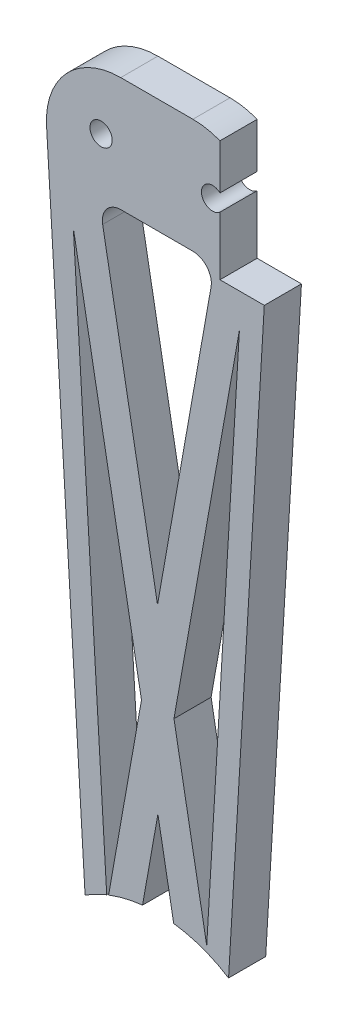
ISO-10303-21;
HEADER;
FILE_DESCRIPTION(('STEP AP214'),'2;1');
FILE_NAME('part.step','',(''),(''),'','','');
FILE_SCHEMA(('AUTOMOTIVE_DESIGN { 1 0 10303 214 1 1 1 1 }'));
ENDSEC;
DATA;
#1=APPLICATION_CONTEXT('core data for automotive mechanical design processes');
#2=APPLICATION_PROTOCOL_DEFINITION('international standard','automotive_design',2000,#1);
#3=PRODUCT_CONTEXT('',#1,'mechanical');
#4=PRODUCT('Part','Part','',(#3));
#5=PRODUCT_RELATED_PRODUCT_CATEGORY('part','',(#4));
#6=PRODUCT_DEFINITION_FORMATION('','',#4);
#7=PRODUCT_DEFINITION_CONTEXT('part definition',#1,'design');
#8=PRODUCT_DEFINITION('design','',#6,#7);
#9=PRODUCT_DEFINITION_SHAPE('','',#8);
#10=(LENGTH_UNIT() NAMED_UNIT(*) SI_UNIT(.MILLI.,.METRE.));
#11=(NAMED_UNIT(*) PLANE_ANGLE_UNIT() SI_UNIT($,.RADIAN.));
#12=(NAMED_UNIT(*) SI_UNIT($,.STERADIAN.) SOLID_ANGLE_UNIT());
#13=UNCERTAINTY_MEASURE_WITH_UNIT(LENGTH_MEASURE(1.E-05),#10,'distance_accuracy_value','');
#14=(GEOMETRIC_REPRESENTATION_CONTEXT(3) GLOBAL_UNCERTAINTY_ASSIGNED_CONTEXT((#13)) GLOBAL_UNIT_ASSIGNED_CONTEXT((#10,
#11,#12)) REPRESENTATION_CONTEXT('',''));
#15=CARTESIAN_POINT('',(0.,0.,0.));
#16=DIRECTION('',(0.,0.,1.));
#17=DIRECTION('',(1.,0.,0.));
#18=AXIS2_PLACEMENT_3D('',#15,#16,#17);
#19=CARTESIAN_POINT('',(0.,0.,10.));
#20=DIRECTION('',(0.,0.,1.));
#21=DIRECTION('',(1.,0.,0.));
#22=AXIS2_PLACEMENT_3D('',#19,#20,#21);
#23=PLANE('',#22);
#24=CARTESIAN_POINT('',(0.,-210.,10.));
#25=DIRECTION('',(0.,0.,1.));
#26=DIRECTION('',(1.,0.,0.));
#27=AXIS2_PLACEMENT_3D('',#24,#25,#26);
#28=CIRCLE('',#27,36.);
#29=CARTESIAN_POINT('',(-3.84009202515425,-174.205395752455,10.));
#30=VERTEX_POINT('',#29);
#31=CARTESIAN_POINT('',(-12.9756578020108,-176.419763184201,10.));
#32=VERTEX_POINT('',#31);
#33=EDGE_CURVE('E295',#30,#32,#28,.T.);
#34=ORIENTED_EDGE('',*,*,#33,.F.);
#35=DIRECTION('',(0.174574666070561,0.984643938673444,0.));
#36=VECTOR('',#35,1.);
#37=CARTESIAN_POINT('',(26.2217824014059,-4.64905000346376,10.));
#38=LINE('',#37,#36);
#39=CARTESIAN_POINT('',(0.29160959832128,-150.901585116392,10.));
#40=VERTEX_POINT('',#39);
#41=EDGE_CURVE('E501',#30,#40,#38,.T.);
#42=ORIENTED_EDGE('',*,*,#41,.T.);
#43=DIRECTION('',(-0.178826073356073,0.983880701857724,0.));
#44=VECTOR('',#43,1.);
#45=CARTESIAN_POINT('',(-26.2678721622271,-4.77433943497515,10.));
#46=LINE('',#45,#44);
#47=CARTESIAN_POINT('',(4.54217202074157,-174.287695771149,10.));
#48=VERTEX_POINT('',#47);
#49=EDGE_CURVE('E504',#48,#40,#46,.T.);
#50=ORIENTED_EDGE('',*,*,#49,.F.);
#51=CARTESIAN_POINT('',(0.,-210.,10.));
#52=DIRECTION('',(0.,0.,1.));
#53=DIRECTION('',(1.,0.,0.));
#54=AXIS2_PLACEMENT_3D('',#51,#52,#53);
#55=CIRCLE('',#54,36.);
#56=CARTESIAN_POINT('',(19.3085635130686,-179.616132980448,10.));
#57=VERTEX_POINT('',#56);
#58=EDGE_CURVE('E546',#57,#48,#55,.T.);
#59=ORIENTED_EDGE('',*,*,#58,.F.);
#60=DIRECTION('',(-0.0594186399842153,-0.998233151734817,0.));
#61=VECTOR('',#60,1.);
#62=CARTESIAN_POINT('',(29.8940827566728,-1.77940968789719,10.));
#63=LINE('',#62,#61);
#64=CARTESIAN_POINT('',(28.9285714285714,-18.,10.));
#65=VERTEX_POINT('',#64);
#66=EDGE_CURVE('E389',#65,#57,#63,.T.);
#67=ORIENTED_EDGE('',*,*,#66,.F.);
#68=DIRECTION('',(1.,0.,0.));
#69=VECTOR('',#68,1.);
#70=CARTESIAN_POINT('',(0.,-18.,10.));
#71=LINE('',#70,#69);
#72=CARTESIAN_POINT('',(17.,-18.,10.));
#73=VERTEX_POINT('',#72);
#74=EDGE_CURVE('E523',#73,#65,#71,.T.);
#75=ORIENTED_EDGE('',*,*,#74,.F.);
#76=DIRECTION('',(0.,1.,0.));
#77=VECTOR('',#76,1.);
#78=CARTESIAN_POINT('',(17.,0.,10.));
#79=LINE('',#78,#77);
#80=CARTESIAN_POINT('',(17.,-2.23606797749979,10.));
#81=VERTEX_POINT('',#80);
#82=EDGE_CURVE('E525',#73,#81,#79,.T.);
#83=ORIENTED_EDGE('',*,*,#82,.T.);
#84=CARTESIAN_POINT('',(15.,0.,10.));
#85=DIRECTION('',(0.,0.,1.));
#86=DIRECTION('',(1.,0.,0.));
#87=AXIS2_PLACEMENT_3D('',#84,#85,#86);
#88=CIRCLE('',#87,3.);
#89=CARTESIAN_POINT('',(17.,2.23606797749979,10.));
#90=VERTEX_POINT('',#89);
#91=EDGE_CURVE('E394',#90,#81,#88,.T.);
#92=ORIENTED_EDGE('',*,*,#91,.F.);
#93=DIRECTION('',(0.,1.,0.));
#94=VECTOR('',#93,1.);
#95=CARTESIAN_POINT('',(17.,0.,10.));
#96=LINE('',#95,#94);
#97=CARTESIAN_POINT('',(17.,14.395591770238,10.));
#98=VERTEX_POINT('',#97);
#99=EDGE_CURVE('E528',#90,#98,#96,.T.);
#100=ORIENTED_EDGE('',*,*,#99,.T.);
#101=CARTESIAN_POINT('',(9.71283934950197,-4.22958714578407,10.));
#102=DIRECTION('',(0.,0.,1.));
#103=DIRECTION('',(1.,0.,0.));
#104=AXIS2_PLACEMENT_3D('',#101,#102,#103);
#105=CIRCLE('',#104,20.);
#106=CARTESIAN_POINT('',(9.71283934950197,15.7704128542159,10.));
#107=VERTEX_POINT('',#106);
#108=EDGE_CURVE('E336',#98,#107,#105,.T.);
#109=ORIENTED_EDGE('',*,*,#108,.T.);
#110=DIRECTION('',(1.,0.,0.));
#111=VECTOR('',#110,1.);
#112=CARTESIAN_POINT('',(0.,15.7704128542159,10.));
#113=LINE('',#112,#111);
#114=CARTESIAN_POINT('',(-9.71283934950197,15.7704128542159,10.));
#115=VERTEX_POINT('',#114);
#116=EDGE_CURVE('E392',#115,#107,#113,.T.);
#117=ORIENTED_EDGE('',*,*,#116,.F.);
#118=CARTESIAN_POINT('',(-9.71283934950197,-4.22958714578407,10.));
#119=DIRECTION('',(0.,0.,1.));
#120=DIRECTION('',(1.,0.,0.));
#121=AXIS2_PLACEMENT_3D('',#118,#119,#120);
#122=CIRCLE('',#121,20.);
#123=CARTESIAN_POINT('',(-29.6775023841983,-5.41795994546837,10.));
#124=VERTEX_POINT('',#123);
#125=EDGE_CURVE('E328',#115,#124,#122,.T.);
#126=ORIENTED_EDGE('',*,*,#125,.T.);
#127=DIRECTION('',(0.0594186399842153,-0.998233151734817,0.));
#128=VECTOR('',#127,1.);
#129=CARTESIAN_POINT('',(-29.8940827566728,-1.77940968789719,10.));
#130=LINE('',#129,#128);
#131=CARTESIAN_POINT('',(-19.3085635130686,-179.616132980448,10.));
#132=VERTEX_POINT('',#131);
#133=EDGE_CURVE('E322',#124,#132,#130,.T.);
#134=ORIENTED_EDGE('',*,*,#133,.T.);
#135=CARTESIAN_POINT('',(0.,-210.,10.));
#136=DIRECTION('',(0.,0.,1.));
#137=DIRECTION('',(1.,0.,0.));
#138=AXIS2_PLACEMENT_3D('',#135,#136,#137);
#139=CIRCLE('',#138,36.);
#140=CARTESIAN_POINT('',(-13.4867994081427,-176.621769943202,10.));
#141=VERTEX_POINT('',#140);
#142=EDGE_CURVE('E277',#141,#132,#139,.T.);
#143=ORIENTED_EDGE('',*,*,#142,.F.);
#144=DIRECTION('',(-0.0594186399842153,0.998233151734817,0.));
#145=VECTOR('',#144,1.);
#146=CARTESIAN_POINT('',(-23.9152662053382,-1.42352775031775,10.));
#147=LINE('',#146,#145);
#148=CARTESIAN_POINT('',(-22.4730270714025,-25.6531452004381,10.));
#149=VERTEX_POINT('',#148);
#150=EDGE_CURVE('E465',#141,#149,#147,.T.);
#151=ORIENTED_EDGE('',*,*,#150,.T.);
#152=DIRECTION('',(-0.178826073356073,0.983880701857724,0.));
#153=VECTOR('',#152,1.);
#154=CARTESIAN_POINT('',(-26.2678721622271,-4.77433943497515,10.));
#155=LINE('',#154,#153);
#156=CARTESIAN_POINT('',(-4.13415620386734,-126.551525407566,10.));
#157=VERTEX_POINT('',#156);
#158=EDGE_CURVE('E488',#157,#149,#155,.T.);
#159=ORIENTED_EDGE('',*,*,#158,.F.);
#160=DIRECTION('',(0.174574666070561,0.984643938673444,0.));
#161=VECTOR('',#160,1.);
#162=CARTESIAN_POINT('',(17.7452712206691,-3.14618785126878,10.));
#163=LINE('',#162,#161);
#164=EDGE_CURVE('E491',#32,#157,#163,.T.);
#165=ORIENTED_EDGE('',*,*,#164,.F.);
#166=EDGE_LOOP('',(#34,#42,#50,#59,#67,#75,#83,#92,#100,#109,#117,#126,#134,#143,#151,#159,#165));
#167=FACE_BOUND('',#166,.T.);
#168=CARTESIAN_POINT('',(-15.,0.,10.));
#169=DIRECTION('',(0.,0.,1.));
#170=DIRECTION('',(1.,0.,0.));
#171=AXIS2_PLACEMENT_3D('',#168,#169,#170);
#172=CIRCLE('',#171,3.);
#173=CARTESIAN_POINT('',(-12.,0.,10.));
#174=VERTEX_POINT('',#173);
#175=EDGE_CURVE('E311',#174,#174,#172,.T.);
#176=ORIENTED_EDGE('',*,*,#175,.F.);
#177=EDGE_LOOP('',(#176));
#178=FACE_BOUND('',#177,.T.);
#179=DIRECTION('',(0.174574666070561,0.984643938673444,0.));
#180=VECTOR('',#179,1.);
#181=CARTESIAN_POINT('',(17.7452712206691,-3.14618785126878,10.));
#182=LINE('',#181,#180);
#183=CARTESIAN_POINT('',(0.190220551076297,-102.160979768059,10.));
#184=VERTEX_POINT('',#183);
#185=CARTESIAN_POINT('',(14.6023785703389,-20.8728733303528,10.));
#186=VERTEX_POINT('',#185);
#187=EDGE_CURVE('E357',#184,#186,#182,.T.);
#188=ORIENTED_EDGE('',*,*,#187,.F.);
#189=DIRECTION('',(-0.178826073356073,0.983880701857724,0.));
#190=VECTOR('',#189,1.);
#191=CARTESIAN_POINT('',(-17.7904251161172,-3.23351384049256,10.));
#192=LINE('',#191,#190);
#193=CARTESIAN_POINT('',(-14.5805047462184,-20.8941303667804,10.));
#194=VERTEX_POINT('',#193);
#195=EDGE_CURVE('E367',#184,#194,#192,.T.);
#196=ORIENTED_EDGE('',*,*,#195,.T.);
#197=CARTESIAN_POINT('',(-9.66110123692979,-20.,10.));
#198=DIRECTION('',(0.,0.,1.));
#199=DIRECTION('',(1.,0.,0.));
#200=AXIS2_PLACEMENT_3D('',#197,#198,#199);
#201=CIRCLE('',#200,5.);
#202=CARTESIAN_POINT('',(-9.66110123692979,-15.,10.));
#203=VERTEX_POINT('',#202);
#204=EDGE_CURVE('E348',#194,#203,#201,.F.);
#205=ORIENTED_EDGE('',*,*,#204,.T.);
#206=DIRECTION('',(1.,0.,0.));
#207=VECTOR('',#206,1.);
#208=CARTESIAN_POINT('',(0.,-15.,10.));
#209=LINE('',#208,#207);
#210=CARTESIAN_POINT('',(9.67915887697167,-15.,10.));
#211=VERTEX_POINT('',#210);
#212=EDGE_CURVE('E359',#203,#211,#209,.T.);
#213=ORIENTED_EDGE('',*,*,#212,.T.);
#214=CARTESIAN_POINT('',(9.67915887697167,-20.,10.));
#215=DIRECTION('',(0.,0.,1.));
#216=DIRECTION('',(1.,0.,0.));
#217=AXIS2_PLACEMENT_3D('',#214,#215,#216);
#218=CIRCLE('',#217,5.);
#219=EDGE_CURVE('E114',#211,#186,#218,.F.);
#220=ORIENTED_EDGE('',*,*,#219,.T.);
#221=EDGE_LOOP('',(#188,#196,#205,#213,#220));
#222=FACE_BOUND('',#221,.T.);
#223=DIRECTION('',(-0.178826073356073,0.983880701857724,0.));
#224=VECTOR('',#223,1.);
#225=CARTESIAN_POINT('',(-17.7904251161172,-3.23351384049256,10.));
#226=LINE('',#225,#224);
#227=CARTESIAN_POINT('',(13.4301626709257,-175.005634358752,10.));
#228=VERTEX_POINT('',#227);
#229=CARTESIAN_POINT('',(4.61598635326493,-126.511039476885,10.));
#230=VERTEX_POINT('',#229);
#231=EDGE_CURVE('E470',#228,#230,#226,.T.);
#232=ORIENTED_EDGE('',*,*,#231,.T.);
#233=DIRECTION('',(0.174574666070561,0.984643938673444,0.));
#234=VECTOR('',#233,1.);
#235=CARTESIAN_POINT('',(26.2217824014059,-4.64905000346376,10.));
#236=LINE('',#235,#234);
#237=CARTESIAN_POINT('',(22.2304198411749,-27.1613138985647,10.));
#238=VERTEX_POINT('',#237);
#239=EDGE_CURVE('E473',#230,#238,#236,.T.);
#240=ORIENTED_EDGE('',*,*,#239,.T.);
#241=DIRECTION('',(-0.0594186399842153,-0.998233151734817,0.));
#242=VECTOR('',#241,1.);
#243=CARTESIAN_POINT('',(23.7629705178262,-1.41446253082299,10.));
#244=LINE('',#243,#242);
#245=EDGE_CURVE('E466',#238,#228,#244,.T.);
#246=ORIENTED_EDGE('',*,*,#245,.T.);
#247=EDGE_LOOP('',(#232,#240,#246));
#248=FACE_BOUND('',#247,.T.);
#249=ADVANCED_FACE('F106',(#167,#178,#222,#248),#23,.T.);
#250=CARTESIAN_POINT('',(0.,0.,0.));
#251=DIRECTION('',(0.,0.,1.));
#252=DIRECTION('',(1.,0.,0.));
#253=AXIS2_PLACEMENT_3D('',#250,#251,#252);
#254=PLANE('',#253);
#255=DIRECTION('',(0.174574666070561,0.984643938673444,0.));
#256=VECTOR('',#255,1.);
#257=CARTESIAN_POINT('',(26.2217824014059,-4.64905000346376,0.));
#258=LINE('',#257,#256);
#259=CARTESIAN_POINT('',(-3.84009202515425,-174.205395752455,0.));
#260=VERTEX_POINT('',#259);
#261=CARTESIAN_POINT('',(0.291609598321283,-150.901585116392,0.));
#262=VERTEX_POINT('',#261);
#263=EDGE_CURVE('E500',#260,#262,#258,.T.);
#264=ORIENTED_EDGE('',*,*,#263,.F.);
#265=CARTESIAN_POINT('',(0.,-210.,0.));
#266=DIRECTION('',(0.,0.,1.));
#267=DIRECTION('',(1.,0.,0.));
#268=AXIS2_PLACEMENT_3D('',#265,#266,#267);
#269=CIRCLE('',#268,36.);
#270=CARTESIAN_POINT('',(-12.9756578020108,-176.419763184201,0.));
#271=VERTEX_POINT('',#270);
#272=EDGE_CURVE('E535',#260,#271,#269,.T.);
#273=ORIENTED_EDGE('',*,*,#272,.T.);
#274=DIRECTION('',(0.174574666070561,0.984643938673444,0.));
#275=VECTOR('',#274,1.);
#276=CARTESIAN_POINT('',(17.7452712206691,-3.14618785126878,0.));
#277=LINE('',#276,#275);
#278=CARTESIAN_POINT('',(-4.13415620386734,-126.551525407566,0.));
#279=VERTEX_POINT('',#278);
#280=EDGE_CURVE('E495',#271,#279,#277,.T.);
#281=ORIENTED_EDGE('',*,*,#280,.T.);
#282=DIRECTION('',(-0.178826073356073,0.983880701857724,0.));
#283=VECTOR('',#282,1.);
#284=CARTESIAN_POINT('',(-26.2678721622271,-4.77433943497515,0.));
#285=LINE('',#284,#283);
#286=CARTESIAN_POINT('',(-22.4730270714025,-25.6531452004381,0.));
#287=VERTEX_POINT('',#286);
#288=EDGE_CURVE('E485',#279,#287,#285,.T.);
#289=ORIENTED_EDGE('',*,*,#288,.T.);
#290=DIRECTION('',(-0.0594186399842153,0.998233151734817,0.));
#291=VECTOR('',#290,1.);
#292=CARTESIAN_POINT('',(-23.9152662053382,-1.42352775031775,0.));
#293=LINE('',#292,#291);
#294=CARTESIAN_POINT('',(-13.4867994081427,-176.621769943202,0.));
#295=VERTEX_POINT('',#294);
#296=EDGE_CURVE('E293',#295,#287,#293,.T.);
#297=ORIENTED_EDGE('',*,*,#296,.F.);
#298=CARTESIAN_POINT('',(0.,-210.,0.));
#299=DIRECTION('',(0.,0.,1.));
#300=DIRECTION('',(1.,0.,0.));
#301=AXIS2_PLACEMENT_3D('',#298,#299,#300);
#302=CIRCLE('',#301,36.);
#303=CARTESIAN_POINT('',(-19.3085635130686,-179.616132980448,0.));
#304=VERTEX_POINT('',#303);
#305=EDGE_CURVE('E274',#295,#304,#302,.T.);
#306=ORIENTED_EDGE('',*,*,#305,.T.);
#307=DIRECTION('',(0.0594186399842153,-0.998233151734817,0.));
#308=VECTOR('',#307,1.);
#309=CARTESIAN_POINT('',(-29.8940827566728,-1.77940968789719,0.));
#310=LINE('',#309,#308);
#311=CARTESIAN_POINT('',(-29.6775023841983,-5.41795994546837,0.));
#312=VERTEX_POINT('',#311);
#313=EDGE_CURVE('E291',#312,#304,#310,.T.);
#314=ORIENTED_EDGE('',*,*,#313,.F.);
#315=CARTESIAN_POINT('',(-9.71283934950197,-4.22958714578407,0.));
#316=DIRECTION('',(0.,0.,1.));
#317=DIRECTION('',(1.,0.,0.));
#318=AXIS2_PLACEMENT_3D('',#315,#316,#317);
#319=CIRCLE('',#318,20.);
#320=CARTESIAN_POINT('',(-9.71283934950197,15.7704128542159,0.));
#321=VERTEX_POINT('',#320);
#322=EDGE_CURVE('E324',#312,#321,#319,.F.);
#323=ORIENTED_EDGE('',*,*,#322,.T.);
#324=DIRECTION('',(1.,0.,0.));
#325=VECTOR('',#324,1.);
#326=CARTESIAN_POINT('',(0.,15.7704128542159,0.));
#327=LINE('',#326,#325);
#328=CARTESIAN_POINT('',(9.71283934950197,15.7704128542159,0.));
#329=VERTEX_POINT('',#328);
#330=EDGE_CURVE('E305',#321,#329,#327,.T.);
#331=ORIENTED_EDGE('',*,*,#330,.T.);
#332=CARTESIAN_POINT('',(9.71283934950197,-4.22958714578407,0.));
#333=DIRECTION('',(0.,0.,1.));
#334=DIRECTION('',(1.,0.,0.));
#335=AXIS2_PLACEMENT_3D('',#332,#333,#334);
#336=CIRCLE('',#335,20.);
#337=CARTESIAN_POINT('',(17.,14.395591770238,0.));
#338=VERTEX_POINT('',#337);
#339=EDGE_CURVE('E333',#329,#338,#336,.F.);
#340=ORIENTED_EDGE('',*,*,#339,.T.);
#341=DIRECTION('',(0.,1.,0.));
#342=VECTOR('',#341,1.);
#343=CARTESIAN_POINT('',(17.,0.,0.));
#344=LINE('',#343,#342);
#345=CARTESIAN_POINT('',(17.,2.23606797749979,0.));
#346=VERTEX_POINT('',#345);
#347=EDGE_CURVE('E129',#346,#338,#344,.T.);
#348=ORIENTED_EDGE('',*,*,#347,.F.);
#349=CARTESIAN_POINT('',(15.,0.,0.));
#350=DIRECTION('',(0.,0.,1.));
#351=DIRECTION('',(1.,0.,0.));
#352=AXIS2_PLACEMENT_3D('',#349,#350,#351);
#353=CIRCLE('',#352,3.);
#354=CARTESIAN_POINT('',(17.,-2.23606797749979,0.));
#355=VERTEX_POINT('',#354);
#356=EDGE_CURVE('E316',#346,#355,#353,.T.);
#357=ORIENTED_EDGE('',*,*,#356,.T.);
#358=DIRECTION('',(0.,1.,0.));
#359=VECTOR('',#358,1.);
#360=CARTESIAN_POINT('',(17.,0.,0.));
#361=LINE('',#360,#359);
#362=CARTESIAN_POINT('',(17.,-18.,0.));
#363=VERTEX_POINT('',#362);
#364=EDGE_CURVE('E121',#363,#355,#361,.T.);
#365=ORIENTED_EDGE('',*,*,#364,.F.);
#366=DIRECTION('',(1.,0.,0.));
#367=VECTOR('',#366,1.);
#368=CARTESIAN_POINT('',(0.,-18.,0.));
#369=LINE('',#368,#367);
#370=CARTESIAN_POINT('',(28.9285714285714,-18.,0.));
#371=VERTEX_POINT('',#370);
#372=EDGE_CURVE('E514',#363,#371,#369,.T.);
#373=ORIENTED_EDGE('',*,*,#372,.T.);
#374=DIRECTION('',(-0.0594186399842153,-0.998233151734817,0.));
#375=VECTOR('',#374,1.);
#376=CARTESIAN_POINT('',(29.8940827566728,-1.77940968789719,0.));
#377=LINE('',#376,#375);
#378=CARTESIAN_POINT('',(19.3085635130686,-179.616132980448,0.));
#379=VERTEX_POINT('',#378);
#380=EDGE_CURVE('E301',#371,#379,#377,.T.);
#381=ORIENTED_EDGE('',*,*,#380,.T.);
#382=CARTESIAN_POINT('',(0.,-210.,0.));
#383=DIRECTION('',(0.,0.,1.));
#384=DIRECTION('',(1.,0.,0.));
#385=AXIS2_PLACEMENT_3D('',#382,#383,#384);
#386=CIRCLE('',#385,36.);
#387=CARTESIAN_POINT('',(4.54217202074156,-174.287695771149,0.));
#388=VERTEX_POINT('',#387);
#389=EDGE_CURVE('E294',#379,#388,#386,.T.);
#390=ORIENTED_EDGE('',*,*,#389,.T.);
#391=DIRECTION('',(-0.178826073356073,0.983880701857724,0.));
#392=VECTOR('',#391,1.);
#393=CARTESIAN_POINT('',(-26.2678721622271,-4.77433943497515,0.));
#394=LINE('',#393,#392);
#395=EDGE_CURVE('E503',#388,#262,#394,.T.);
#396=ORIENTED_EDGE('',*,*,#395,.T.);
#397=EDGE_LOOP('',(#264,#273,#281,#289,#297,#306,#314,#323,#331,#340,#348,#357,#365,#373,#381,
#390,#396));
#398=FACE_BOUND('',#397,.T.);
#399=CARTESIAN_POINT('',(-15.,0.,0.));
#400=DIRECTION('',(0.,0.,1.));
#401=DIRECTION('',(1.,0.,0.));
#402=AXIS2_PLACEMENT_3D('',#399,#400,#401);
#403=CIRCLE('',#402,3.);
#404=CARTESIAN_POINT('',(-12.,0.,0.));
#405=VERTEX_POINT('',#404);
#406=EDGE_CURVE('E319',#405,#405,#403,.T.);
#407=ORIENTED_EDGE('',*,*,#406,.T.);
#408=EDGE_LOOP('',(#407));
#409=FACE_BOUND('',#408,.T.);
#410=DIRECTION('',(-0.178826073356073,0.983880701857724,0.));
#411=VECTOR('',#410,1.);
#412=CARTESIAN_POINT('',(-17.7904251161172,-3.23351384049256,0.));
#413=LINE('',#412,#411);
#414=CARTESIAN_POINT('',(0.190220551076304,-102.160979768059,0.));
#415=VERTEX_POINT('',#414);
#416=CARTESIAN_POINT('',(-14.5805047462184,-20.8941303667804,0.));
#417=VERTEX_POINT('',#416);
#418=EDGE_CURVE('E381',#415,#417,#413,.T.);
#419=ORIENTED_EDGE('',*,*,#418,.F.);
#420=DIRECTION('',(0.174574666070561,0.984643938673444,0.));
#421=VECTOR('',#420,1.);
#422=CARTESIAN_POINT('',(17.7452712206691,-3.14618785126878,0.));
#423=LINE('',#422,#421);
#424=CARTESIAN_POINT('',(14.6023785703389,-20.8728733303528,0.));
#425=VERTEX_POINT('',#424);
#426=EDGE_CURVE('E376',#415,#425,#423,.T.);
#427=ORIENTED_EDGE('',*,*,#426,.T.);
#428=CARTESIAN_POINT('',(9.67915887697167,-20.,0.));
#429=DIRECTION('',(0.,0.,1.));
#430=DIRECTION('',(1.,0.,0.));
#431=AXIS2_PLACEMENT_3D('',#428,#429,#430);
#432=CIRCLE('',#431,5.);
#433=CARTESIAN_POINT('',(9.67915887697167,-15.,0.));
#434=VERTEX_POINT('',#433);
#435=EDGE_CURVE('E12',#425,#434,#432,.T.);
#436=ORIENTED_EDGE('',*,*,#435,.T.);
#437=DIRECTION('',(1.,0.,0.));
#438=VECTOR('',#437,1.);
#439=CARTESIAN_POINT('',(0.,-15.,0.));
#440=LINE('',#439,#438);
#441=CARTESIAN_POINT('',(-9.66110123692979,-15.,0.));
#442=VERTEX_POINT('',#441);
#443=EDGE_CURVE('E308',#442,#434,#440,.T.);
#444=ORIENTED_EDGE('',*,*,#443,.F.);
#445=CARTESIAN_POINT('',(-9.66110123692979,-20.,0.));
#446=DIRECTION('',(0.,0.,1.));
#447=DIRECTION('',(1.,0.,0.));
#448=AXIS2_PLACEMENT_3D('',#445,#446,#447);
#449=CIRCLE('',#448,5.);
#450=EDGE_CURVE('E350',#442,#417,#449,.T.);
#451=ORIENTED_EDGE('',*,*,#450,.T.);
#452=EDGE_LOOP('',(#419,#427,#436,#444,#451));
#453=FACE_BOUND('',#452,.T.);
#454=DIRECTION('',(0.174574666070561,0.984643938673444,0.));
#455=VECTOR('',#454,1.);
#456=CARTESIAN_POINT('',(26.2217824014059,-4.64905000346376,0.));
#457=LINE('',#456,#455);
#458=CARTESIAN_POINT('',(4.61598635326493,-126.511039476885,0.));
#459=VERTEX_POINT('',#458);
#460=CARTESIAN_POINT('',(22.2304198411749,-27.1613138985647,0.));
#461=VERTEX_POINT('',#460);
#462=EDGE_CURVE('E469',#459,#461,#457,.T.);
#463=ORIENTED_EDGE('',*,*,#462,.F.);
#464=DIRECTION('',(-0.178826073356073,0.983880701857724,0.));
#465=VECTOR('',#464,1.);
#466=CARTESIAN_POINT('',(-17.7904251161172,-3.23351384049256,0.));
#467=LINE('',#466,#465);
#468=CARTESIAN_POINT('',(13.4301626709257,-175.005634358752,0.));
#469=VERTEX_POINT('',#468);
#470=EDGE_CURVE('E479',#469,#459,#467,.T.);
#471=ORIENTED_EDGE('',*,*,#470,.F.);
#472=DIRECTION('',(-0.0594186399842153,-0.998233151734817,0.));
#473=VECTOR('',#472,1.);
#474=CARTESIAN_POINT('',(23.7629705178262,-1.41446253082299,0.));
#475=LINE('',#474,#473);
#476=EDGE_CURVE('E460',#461,#469,#475,.T.);
#477=ORIENTED_EDGE('',*,*,#476,.F.);
#478=EDGE_LOOP('',(#463,#471,#477));
#479=FACE_BOUND('',#478,.T.);
#480=ADVANCED_FACE('F289',(#398,#409,#453,#479),#254,.F.);
#481=CARTESIAN_POINT('',(15.,0.,10.));
#482=DIRECTION('',(0.,0.,-1.));
#483=DIRECTION('',(-1.,0.,0.));
#484=AXIS2_PLACEMENT_3D('',#481,#482,#483);
#485=CYLINDRICAL_SURFACE('',#484,3.);
#486=ORIENTED_EDGE('',*,*,#356,.F.);
#487=DIRECTION('',(0.,0.,1.));
#488=VECTOR('',#487,1.);
#489=CARTESIAN_POINT('',(17.,2.23606797749979,0.));
#490=LINE('',#489,#488);
#491=EDGE_CURVE('E511',#346,#90,#490,.T.);
#492=ORIENTED_EDGE('',*,*,#491,.T.);
#493=ORIENTED_EDGE('',*,*,#91,.T.);
#494=DIRECTION('',(0.,0.,1.));
#495=VECTOR('',#494,1.);
#496=CARTESIAN_POINT('',(17.,-2.23606797749979,0.));
#497=LINE('',#496,#495);
#498=EDGE_CURVE('E513',#355,#81,#497,.T.);
#499=ORIENTED_EDGE('',*,*,#498,.F.);
#500=EDGE_LOOP('',(#486,#492,#493,#499));
#501=FACE_BOUND('',#500,.T.);
#502=ADVANCED_FACE('F412',(#501),#485,.F.);
#503=CARTESIAN_POINT('',(9.71283934950197,-4.22958714578407,10.));
#504=DIRECTION('',(0.,0.,-1.));
#505=DIRECTION('',(-1.,0.,0.));
#506=AXIS2_PLACEMENT_3D('',#503,#504,#505);
#507=CYLINDRICAL_SURFACE('',#506,20.);
#508=ORIENTED_EDGE('',*,*,#108,.F.);
#509=DIRECTION('',(0.,0.,1.));
#510=VECTOR('',#509,1.);
#511=CARTESIAN_POINT('',(17.,14.395591770238,0.));
#512=LINE('',#511,#510);
#513=EDGE_CURVE('E521',#338,#98,#512,.T.);
#514=ORIENTED_EDGE('',*,*,#513,.F.);
#515=ORIENTED_EDGE('',*,*,#339,.F.);
#516=DIRECTION('',(0.,0.,-1.));
#517=VECTOR('',#516,1.);
#518=CARTESIAN_POINT('',(9.71283934950197,15.7704128542159,10.));
#519=LINE('',#518,#517);
#520=EDGE_CURVE('E330',#107,#329,#519,.T.);
#521=ORIENTED_EDGE('',*,*,#520,.F.);
#522=EDGE_LOOP('',(#508,#514,#515,#521));
#523=FACE_BOUND('',#522,.T.);
#524=ADVANCED_FACE('F425',(#523),#507,.T.);
#525=CARTESIAN_POINT('',(-29.8940827566728,-1.77940968789719,10.));
#526=DIRECTION('',(0.998233151734817,0.0594186399842152,0.));
#527=DIRECTION('',(-0.0594186399842152,0.998233151734817,0.));
#528=AXIS2_PLACEMENT_3D('',#525,#526,#527);
#529=PLANE('',#528);
#530=ORIENTED_EDGE('',*,*,#313,.T.);
#531=DIRECTION('',(0.,0.,1.));
#532=VECTOR('',#531,1.);
#533=CARTESIAN_POINT('',(-19.3085635130686,-179.616132980448,0.));
#534=LINE('',#533,#532);
#535=EDGE_CURVE('E271',#304,#132,#534,.T.);
#536=ORIENTED_EDGE('',*,*,#535,.T.);
#537=ORIENTED_EDGE('',*,*,#133,.F.);
#538=DIRECTION('',(0.,0.,-1.));
#539=VECTOR('',#538,1.);
#540=CARTESIAN_POINT('',(-29.6775023841983,-5.41795994546837,0.));
#541=LINE('',#540,#539);
#542=EDGE_CURVE('E300',#124,#312,#541,.T.);
#543=ORIENTED_EDGE('',*,*,#542,.T.);
#544=EDGE_LOOP('',(#530,#536,#537,#543));
#545=FACE_BOUND('',#544,.T.);
#546=ADVANCED_FACE('F298',(#545),#529,.F.);
#547=CARTESIAN_POINT('',(29.8940827566728,-1.77940968789719,10.));
#548=DIRECTION('',(0.998233151734817,-0.0594186399842152,0.));
#549=DIRECTION('',(0.0594186399842152,0.998233151734817,0.));
#550=AXIS2_PLACEMENT_3D('',#547,#548,#549);
#551=PLANE('',#550);
#552=DIRECTION('',(0.,0.,1.));
#553=VECTOR('',#552,1.);
#554=CARTESIAN_POINT('',(19.3085635130686,-179.616132980448,0.));
#555=LINE('',#554,#553);
#556=EDGE_CURVE('E282',#379,#57,#555,.T.);
#557=ORIENTED_EDGE('',*,*,#556,.F.);
#558=ORIENTED_EDGE('',*,*,#380,.F.);
#559=DIRECTION('',(0.,0.,1.));
#560=VECTOR('',#559,1.);
#561=CARTESIAN_POINT('',(28.9285714285714,-18.,0.));
#562=LINE('',#561,#560);
#563=EDGE_CURVE('E518',#371,#65,#562,.T.);
#564=ORIENTED_EDGE('',*,*,#563,.T.);
#565=ORIENTED_EDGE('',*,*,#66,.T.);
#566=EDGE_LOOP('',(#557,#558,#564,#565));
#567=FACE_BOUND('',#566,.T.);
#568=ADVANCED_FACE('F428',(#567),#551,.T.);
#569=CARTESIAN_POINT('',(0.,15.7704128542159,10.));
#570=DIRECTION('',(0.,1.,0.));
#571=DIRECTION('',(0.,0.,1.));
#572=AXIS2_PLACEMENT_3D('',#569,#570,#571);
#573=PLANE('',#572);
#574=ORIENTED_EDGE('',*,*,#116,.T.);
#575=ORIENTED_EDGE('',*,*,#520,.T.);
#576=ORIENTED_EDGE('',*,*,#330,.F.);
#577=DIRECTION('',(0.,0.,-1.));
#578=VECTOR('',#577,1.);
#579=CARTESIAN_POINT('',(-9.71283934950197,15.7704128542159,10.));
#580=LINE('',#579,#578);
#581=EDGE_CURVE('E326',#321,#115,#580,.F.);
#582=ORIENTED_EDGE('',*,*,#581,.T.);
#583=EDGE_LOOP('',(#574,#575,#576,#582));
#584=FACE_BOUND('',#583,.T.);
#585=ADVANCED_FACE('F422',(#584),#573,.T.);
#586=CARTESIAN_POINT('',(-15.,0.,10.));
#587=DIRECTION('',(0.,0.,-1.));
#588=DIRECTION('',(-1.,0.,0.));
#589=AXIS2_PLACEMENT_3D('',#586,#587,#588);
#590=CYLINDRICAL_SURFACE('',#589,3.);
#591=ORIENTED_EDGE('',*,*,#175,.T.);
#592=EDGE_LOOP('',(#591));
#593=FACE_BOUND('',#592,.T.);
#594=ORIENTED_EDGE('',*,*,#406,.F.);
#595=EDGE_LOOP('',(#594));
#596=FACE_BOUND('',#595,.T.);
#597=ADVANCED_FACE('F402',(#593,#596),#590,.F.);
#598=CARTESIAN_POINT('',(-9.71283934950197,-4.22958714578407,10.));
#599=DIRECTION('',(0.,0.,1.));
#600=DIRECTION('',(1.,0.,0.));
#601=AXIS2_PLACEMENT_3D('',#598,#599,#600);
#602=CYLINDRICAL_SURFACE('',#601,20.);
#603=ORIENTED_EDGE('',*,*,#125,.F.);
#604=ORIENTED_EDGE('',*,*,#581,.F.);
#605=ORIENTED_EDGE('',*,*,#322,.F.);
#606=ORIENTED_EDGE('',*,*,#542,.F.);
#607=EDGE_LOOP('',(#603,#604,#605,#606));
#608=FACE_BOUND('',#607,.T.);
#609=ADVANCED_FACE('F421',(#608),#602,.T.);
#610=CARTESIAN_POINT('',(-17.7904251161172,-3.23351384049256,0.));
#611=DIRECTION('',(0.983880701857725,0.178826073356073,0.));
#612=DIRECTION('',(-0.178826073356073,0.983880701857725,0.));
#613=AXIS2_PLACEMENT_3D('',#610,#611,#612);
#614=PLANE('',#613);
#615=ORIENTED_EDGE('',*,*,#418,.T.);
#616=DIRECTION('',(0.,0.,1.));
#617=VECTOR('',#616,1.);
#618=CARTESIAN_POINT('',(-14.5805047462184,-20.8941303667804,10.));
#619=LINE('',#618,#617);
#620=EDGE_CURVE('E338',#417,#194,#619,.T.);
#621=ORIENTED_EDGE('',*,*,#620,.T.);
#622=ORIENTED_EDGE('',*,*,#195,.F.);
#623=DIRECTION('',(0.,0.,1.));
#624=VECTOR('',#623,1.);
#625=CARTESIAN_POINT('',(0.190220551076304,-102.160979768059,0.));
#626=LINE('',#625,#624);
#627=EDGE_CURVE('E302',#415,#184,#626,.T.);
#628=ORIENTED_EDGE('',*,*,#627,.F.);
#629=EDGE_LOOP('',(#615,#621,#622,#628));
#630=FACE_BOUND('',#629,.T.);
#631=ADVANCED_FACE('F416',(#630),#614,.T.);
#632=CARTESIAN_POINT('',(0.,-15.,0.));
#633=DIRECTION('',(0.,-1.,0.));
#634=DIRECTION('',(0.,0.,-1.));
#635=AXIS2_PLACEMENT_3D('',#632,#633,#634);
#636=PLANE('',#635);
#637=ORIENTED_EDGE('',*,*,#212,.F.);
#638=DIRECTION('',(0.,0.,1.));
#639=VECTOR('',#638,1.);
#640=CARTESIAN_POINT('',(-9.66110123692979,-15.,0.));
#641=LINE('',#640,#639);
#642=EDGE_CURVE('E344',#203,#442,#641,.F.);
#643=ORIENTED_EDGE('',*,*,#642,.T.);
#644=ORIENTED_EDGE('',*,*,#443,.T.);
#645=DIRECTION('',(0.,0.,1.));
#646=VECTOR('',#645,1.);
#647=CARTESIAN_POINT('',(9.67915887697167,-15.,0.));
#648=LINE('',#647,#646);
#649=EDGE_CURVE('E341',#434,#211,#648,.T.);
#650=ORIENTED_EDGE('',*,*,#649,.T.);
#651=EDGE_LOOP('',(#637,#643,#644,#650));
#652=FACE_BOUND('',#651,.T.);
#653=ADVANCED_FACE('F378',(#652),#636,.T.);
#654=CARTESIAN_POINT('',(17.7452712206691,-3.14618785126878,0.));
#655=DIRECTION('',(0.984643938673444,-0.174574666070561,0.));
#656=DIRECTION('',(0.174574666070561,0.984643938673444,0.));
#657=AXIS2_PLACEMENT_3D('',#654,#655,#656);
#658=PLANE('',#657);
#659=ORIENTED_EDGE('',*,*,#187,.T.);
#660=DIRECTION('',(0.,0.,1.));
#661=VECTOR('',#660,1.);
#662=CARTESIAN_POINT('',(14.6023785703389,-20.8728733303528,0.));
#663=LINE('',#662,#661);
#664=EDGE_CURVE('E346',#186,#425,#663,.F.);
#665=ORIENTED_EDGE('',*,*,#664,.T.);
#666=ORIENTED_EDGE('',*,*,#426,.F.);
#667=ORIENTED_EDGE('',*,*,#627,.T.);
#668=EDGE_LOOP('',(#659,#665,#666,#667));
#669=FACE_BOUND('',#668,.T.);
#670=ADVANCED_FACE('F364',(#669),#658,.F.);
#671=CARTESIAN_POINT('',(26.2217824014059,-4.64905000346376,0.));
#672=DIRECTION('',(0.984643938673444,-0.174574666070561,0.));
#673=DIRECTION('',(0.174574666070561,0.984643938673444,0.));
#674=AXIS2_PLACEMENT_3D('',#671,#672,#673);
#675=PLANE('',#674);
#676=DIRECTION('',(0.,0.,1.));
#677=VECTOR('',#676,1.);
#678=CARTESIAN_POINT('',(-3.84009202515425,-174.205395752455,0.));
#679=LINE('',#678,#677);
#680=EDGE_CURVE('E541',#260,#30,#679,.T.);
#681=ORIENTED_EDGE('',*,*,#680,.F.);
#682=ORIENTED_EDGE('',*,*,#263,.T.);
#683=DIRECTION('',(0.,0.,1.));
#684=VECTOR('',#683,1.);
#685=CARTESIAN_POINT('',(0.29160959832128,-150.901585116392,0.));
#686=LINE('',#685,#684);
#687=EDGE_CURVE('E476',#262,#40,#686,.T.);
#688=ORIENTED_EDGE('',*,*,#687,.T.);
#689=ORIENTED_EDGE('',*,*,#41,.F.);
#690=EDGE_LOOP('',(#681,#682,#688,#689));
#691=FACE_BOUND('',#690,.T.);
#692=ADVANCED_FACE('F563',(#691),#675,.T.);
#693=CARTESIAN_POINT('',(-26.2678721622271,-4.77433943497515,0.));
#694=DIRECTION('',(0.983880701857725,0.178826073356073,0.));
#695=DIRECTION('',(-0.178826073356073,0.983880701857725,0.));
#696=AXIS2_PLACEMENT_3D('',#693,#694,#695);
#697=PLANE('',#696);
#698=ORIENTED_EDGE('',*,*,#395,.F.);
#699=DIRECTION('',(0.,0.,1.));
#700=VECTOR('',#699,1.);
#701=CARTESIAN_POINT('',(4.54217202074156,-174.287695771149,0.));
#702=LINE('',#701,#700);
#703=EDGE_CURVE('E538',#388,#48,#702,.T.);
#704=ORIENTED_EDGE('',*,*,#703,.T.);
#705=ORIENTED_EDGE('',*,*,#49,.T.);
#706=ORIENTED_EDGE('',*,*,#687,.F.);
#707=EDGE_LOOP('',(#698,#704,#705,#706));
#708=FACE_BOUND('',#707,.T.);
#709=ADVANCED_FACE('F558',(#708),#697,.F.);
#710=CARTESIAN_POINT('',(26.2217824014059,-4.64905000346376,0.));
#711=DIRECTION('',(0.984643938673444,-0.174574666070561,0.));
#712=DIRECTION('',(0.174574666070561,0.984643938673444,0.));
#713=AXIS2_PLACEMENT_3D('',#710,#711,#712);
#714=PLANE('',#713);
#715=ORIENTED_EDGE('',*,*,#239,.F.);
#716=DIRECTION('',(0.,0.,1.));
#717=VECTOR('',#716,1.);
#718=CARTESIAN_POINT('',(4.61598635326493,-126.511039476885,0.));
#719=LINE('',#718,#717);
#720=EDGE_CURVE('E456',#459,#230,#719,.T.);
#721=ORIENTED_EDGE('',*,*,#720,.F.);
#722=ORIENTED_EDGE('',*,*,#462,.T.);
#723=DIRECTION('',(0.,0.,1.));
#724=VECTOR('',#723,1.);
#725=CARTESIAN_POINT('',(22.2304198411749,-27.1613138985647,0.));
#726=LINE('',#725,#724);
#727=EDGE_CURVE('E462',#461,#238,#726,.T.);
#728=ORIENTED_EDGE('',*,*,#727,.T.);
#729=EDGE_LOOP('',(#715,#721,#722,#728));
#730=FACE_BOUND('',#729,.T.);
#731=ADVANCED_FACE('F588',(#730),#714,.T.);
#732=CARTESIAN_POINT('',(23.7629705178262,-1.41446253082299,0.));
#733=DIRECTION('',(-0.998233151734817,0.0594186399842153,0.));
#734=DIRECTION('',(-0.0594186399842153,-0.998233151734817,0.));
#735=AXIS2_PLACEMENT_3D('',#732,#733,#734);
#736=PLANE('',#735);
#737=ORIENTED_EDGE('',*,*,#245,.F.);
#738=ORIENTED_EDGE('',*,*,#727,.F.);
#739=ORIENTED_EDGE('',*,*,#476,.T.);
#740=DIRECTION('',(0.,0.,1.));
#741=VECTOR('',#740,1.);
#742=CARTESIAN_POINT('',(13.4301626709257,-175.005634358752,0.));
#743=LINE('',#742,#741);
#744=EDGE_CURVE('E459',#469,#228,#743,.T.);
#745=ORIENTED_EDGE('',*,*,#744,.T.);
#746=EDGE_LOOP('',(#737,#738,#739,#745));
#747=FACE_BOUND('',#746,.T.);
#748=ADVANCED_FACE('F583',(#747),#736,.T.);
#749=CARTESIAN_POINT('',(-17.7904251161172,-3.23351384049256,0.));
#750=DIRECTION('',(0.983880701857725,0.178826073356073,0.));
#751=DIRECTION('',(-0.178826073356073,0.983880701857725,0.));
#752=AXIS2_PLACEMENT_3D('',#749,#750,#751);
#753=PLANE('',#752);
#754=ORIENTED_EDGE('',*,*,#231,.F.);
#755=ORIENTED_EDGE('',*,*,#744,.F.);
#756=ORIENTED_EDGE('',*,*,#470,.T.);
#757=ORIENTED_EDGE('',*,*,#720,.T.);
#758=EDGE_LOOP('',(#754,#755,#756,#757));
#759=FACE_BOUND('',#758,.T.);
#760=ADVANCED_FACE('F576',(#759),#753,.T.);
#761=CARTESIAN_POINT('',(-23.9152662053382,-1.42352775031775,0.));
#762=DIRECTION('',(0.998233151734817,0.0594186399842153,0.));
#763=DIRECTION('',(-0.0594186399842153,0.998233151734817,0.));
#764=AXIS2_PLACEMENT_3D('',#761,#762,#763);
#765=PLANE('',#764);
#766=DIRECTION('',(0.,0.,1.));
#767=VECTOR('',#766,1.);
#768=CARTESIAN_POINT('',(-13.4867994081427,-176.621769943202,0.));
#769=LINE('',#768,#767);
#770=EDGE_CURVE('E283',#295,#141,#769,.T.);
#771=ORIENTED_EDGE('',*,*,#770,.F.);
#772=ORIENTED_EDGE('',*,*,#296,.T.);
#773=DIRECTION('',(0.,0.,1.));
#774=VECTOR('',#773,1.);
#775=CARTESIAN_POINT('',(-22.4730270714025,-25.6531452004381,0.));
#776=LINE('',#775,#774);
#777=EDGE_CURVE('E385',#287,#149,#776,.T.);
#778=ORIENTED_EDGE('',*,*,#777,.T.);
#779=ORIENTED_EDGE('',*,*,#150,.F.);
#780=EDGE_LOOP('',(#771,#772,#778,#779));
#781=FACE_BOUND('',#780,.T.);
#782=ADVANCED_FACE('F574',(#781),#765,.T.);
#783=CARTESIAN_POINT('',(-26.2678721622271,-4.77433943497515,0.));
#784=DIRECTION('',(0.983880701857725,0.178826073356073,0.));
#785=DIRECTION('',(-0.178826073356073,0.983880701857725,0.));
#786=AXIS2_PLACEMENT_3D('',#783,#784,#785);
#787=PLANE('',#786);
#788=ORIENTED_EDGE('',*,*,#158,.T.);
#789=ORIENTED_EDGE('',*,*,#777,.F.);
#790=ORIENTED_EDGE('',*,*,#288,.F.);
#791=DIRECTION('',(0.,0.,1.));
#792=VECTOR('',#791,1.);
#793=CARTESIAN_POINT('',(-4.13415620386734,-126.551525407566,0.));
#794=LINE('',#793,#792);
#795=EDGE_CURVE('E482',#279,#157,#794,.T.);
#796=ORIENTED_EDGE('',*,*,#795,.T.);
#797=EDGE_LOOP('',(#788,#789,#790,#796));
#798=FACE_BOUND('',#797,.T.);
#799=ADVANCED_FACE('F449',(#798),#787,.F.);
#800=CARTESIAN_POINT('',(17.7452712206691,-3.14618785126878,0.));
#801=DIRECTION('',(0.984643938673444,-0.174574666070561,0.));
#802=DIRECTION('',(0.174574666070561,0.984643938673444,0.));
#803=AXIS2_PLACEMENT_3D('',#800,#801,#802);
#804=PLANE('',#803);
#805=ORIENTED_EDGE('',*,*,#280,.F.);
#806=DIRECTION('',(0.,0.,1.));
#807=VECTOR('',#806,1.);
#808=CARTESIAN_POINT('',(-12.9756578020108,-176.419763184201,0.));
#809=LINE('',#808,#807);
#810=EDGE_CURVE('E507',#271,#32,#809,.T.);
#811=ORIENTED_EDGE('',*,*,#810,.T.);
#812=ORIENTED_EDGE('',*,*,#164,.T.);
#813=ORIENTED_EDGE('',*,*,#795,.F.);
#814=EDGE_LOOP('',(#805,#811,#812,#813));
#815=FACE_BOUND('',#814,.T.);
#816=ADVANCED_FACE('F442',(#815),#804,.F.);
#817=CARTESIAN_POINT('',(-9.66110123692979,-20.,0.));
#818=DIRECTION('',(0.,0.,-1.));
#819=DIRECTION('',(-1.,0.,0.));
#820=AXIS2_PLACEMENT_3D('',#817,#818,#819);
#821=CYLINDRICAL_SURFACE('',#820,5.);
#822=ORIENTED_EDGE('',*,*,#450,.F.);
#823=ORIENTED_EDGE('',*,*,#642,.F.);
#824=ORIENTED_EDGE('',*,*,#204,.F.);
#825=ORIENTED_EDGE('',*,*,#620,.F.);
#826=EDGE_LOOP('',(#822,#823,#824,#825));
#827=FACE_BOUND('',#826,.T.);
#828=ADVANCED_FACE('F440',(#827),#821,.F.);
#829=CARTESIAN_POINT('',(9.67915887697167,-20.,0.));
#830=DIRECTION('',(0.,0.,1.));
#831=DIRECTION('',(1.,0.,0.));
#832=AXIS2_PLACEMENT_3D('',#829,#830,#831);
#833=CYLINDRICAL_SURFACE('',#832,5.);
#834=ORIENTED_EDGE('',*,*,#435,.F.);
#835=ORIENTED_EDGE('',*,*,#664,.F.);
#836=ORIENTED_EDGE('',*,*,#219,.F.);
#837=ORIENTED_EDGE('',*,*,#649,.F.);
#838=EDGE_LOOP('',(#834,#835,#836,#837));
#839=FACE_BOUND('',#838,.T.);
#840=ADVANCED_FACE('F108',(#839),#833,.F.);
#841=CARTESIAN_POINT('',(0.,-210.,0.));
#842=DIRECTION('',(0.,0.,1.));
#843=DIRECTION('',(1.,0.,0.));
#844=AXIS2_PLACEMENT_3D('',#841,#842,#843);
#845=CYLINDRICAL_SURFACE('',#844,36.);
#846=ORIENTED_EDGE('',*,*,#33,.T.);
#847=ORIENTED_EDGE('',*,*,#810,.F.);
#848=ORIENTED_EDGE('',*,*,#272,.F.);
#849=ORIENTED_EDGE('',*,*,#680,.T.);
#850=EDGE_LOOP('',(#846,#847,#848,#849));
#851=FACE_BOUND('',#850,.T.);
#852=ADVANCED_FACE('F448',(#851),#845,.F.);
#853=CARTESIAN_POINT('',(0.,-210.,0.));
#854=DIRECTION('',(0.,0.,1.));
#855=DIRECTION('',(1.,0.,0.));
#856=AXIS2_PLACEMENT_3D('',#853,#854,#855);
#857=CYLINDRICAL_SURFACE('',#856,36.);
#858=ORIENTED_EDGE('',*,*,#142,.T.);
#859=ORIENTED_EDGE('',*,*,#535,.F.);
#860=ORIENTED_EDGE('',*,*,#305,.F.);
#861=ORIENTED_EDGE('',*,*,#770,.T.);
#862=EDGE_LOOP('',(#858,#859,#860,#861));
#863=FACE_BOUND('',#862,.T.);
#864=ADVANCED_FACE('F273',(#863),#857,.F.);
#865=CARTESIAN_POINT('',(0.,-210.,0.));
#866=DIRECTION('',(0.,0.,1.));
#867=DIRECTION('',(1.,0.,0.));
#868=AXIS2_PLACEMENT_3D('',#865,#866,#867);
#869=CYLINDRICAL_SURFACE('',#868,36.);
#870=ORIENTED_EDGE('',*,*,#58,.T.);
#871=ORIENTED_EDGE('',*,*,#703,.F.);
#872=ORIENTED_EDGE('',*,*,#389,.F.);
#873=ORIENTED_EDGE('',*,*,#556,.T.);
#874=EDGE_LOOP('',(#870,#871,#872,#873));
#875=FACE_BOUND('',#874,.T.);
#876=ADVANCED_FACE('F609',(#875),#869,.F.);
#877=CARTESIAN_POINT('',(17.,0.,0.));
#878=DIRECTION('',(1.,0.,0.));
#879=DIRECTION('',(0.,0.,-1.));
#880=AXIS2_PLACEMENT_3D('',#877,#878,#879);
#881=PLANE('',#880);
#882=ORIENTED_EDGE('',*,*,#99,.F.);
#883=ORIENTED_EDGE('',*,*,#491,.F.);
#884=ORIENTED_EDGE('',*,*,#347,.T.);
#885=ORIENTED_EDGE('',*,*,#513,.T.);
#886=EDGE_LOOP('',(#882,#883,#884,#885));
#887=FACE_BOUND('',#886,.T.);
#888=ADVANCED_FACE('F605',(#887),#881,.T.);
#889=CARTESIAN_POINT('',(0.,-18.,0.));
#890=DIRECTION('',(0.,-1.,0.));
#891=DIRECTION('',(0.,0.,-1.));
#892=AXIS2_PLACEMENT_3D('',#889,#890,#891);
#893=PLANE('',#892);
#894=ORIENTED_EDGE('',*,*,#74,.T.);
#895=ORIENTED_EDGE('',*,*,#563,.F.);
#896=ORIENTED_EDGE('',*,*,#372,.F.);
#897=DIRECTION('',(0.,0.,1.));
#898=VECTOR('',#897,1.);
#899=CARTESIAN_POINT('',(17.,-18.,0.));
#900=LINE('',#899,#898);
#901=EDGE_CURVE('E516',#363,#73,#900,.T.);
#902=ORIENTED_EDGE('',*,*,#901,.T.);
#903=EDGE_LOOP('',(#894,#895,#896,#902));
#904=FACE_BOUND('',#903,.T.);
#905=ADVANCED_FACE('F608',(#904),#893,.F.);
#906=CARTESIAN_POINT('',(17.,0.,0.));
#907=DIRECTION('',(1.,0.,0.));
#908=DIRECTION('',(0.,0.,-1.));
#909=AXIS2_PLACEMENT_3D('',#906,#907,#908);
#910=PLANE('',#909);
#911=ORIENTED_EDGE('',*,*,#82,.F.);
#912=ORIENTED_EDGE('',*,*,#901,.F.);
#913=ORIENTED_EDGE('',*,*,#364,.T.);
#914=ORIENTED_EDGE('',*,*,#498,.T.);
#915=EDGE_LOOP('',(#911,#912,#913,#914));
#916=FACE_BOUND('',#915,.T.);
#917=ADVANCED_FACE('F610',(#916),#910,.T.);
#918=CLOSED_SHELL('',(#249,#480,#502,#524,#546,#568,#585,#597,#609,#631,#653,#670,#692,#709,
#731,#748,#760,#782,#799,#816,#828,#840,#852,#864,#876,#888,#905,#917));
#919=MANIFOLD_SOLID_BREP('B2',#918);
#920=ADVANCED_BREP_SHAPE_REPRESENTATION('',(#18,#919),#14);
#921=SHAPE_DEFINITION_REPRESENTATION(#9,#920);
ENDSEC;
END-ISO-10303-21;
